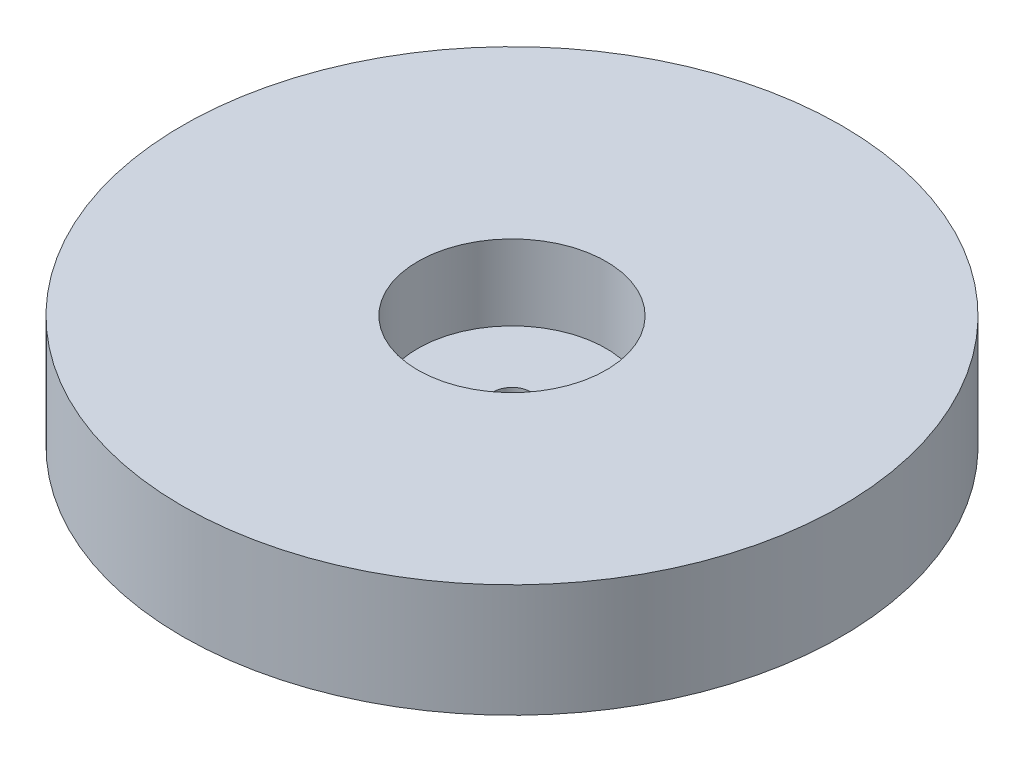
ISO-10303-21;
HEADER;
FILE_DESCRIPTION(('STEP AP214'),'2;1');
FILE_NAME('part.step','',(''),(''),'','','');
FILE_SCHEMA(('AUTOMOTIVE_DESIGN { 1 0 10303 214 1 1 1 1 }'));
ENDSEC;
DATA;
#1=APPLICATION_CONTEXT('core data for automotive mechanical design processes');
#2=APPLICATION_PROTOCOL_DEFINITION('international standard','automotive_design',2000,#1);
#3=PRODUCT_CONTEXT('',#1,'mechanical');
#4=PRODUCT('Part','Part','',(#3));
#5=PRODUCT_RELATED_PRODUCT_CATEGORY('part','',(#4));
#6=PRODUCT_DEFINITION_FORMATION('','',#4);
#7=PRODUCT_DEFINITION_CONTEXT('part definition',#1,'design');
#8=PRODUCT_DEFINITION('design','',#6,#7);
#9=PRODUCT_DEFINITION_SHAPE('','',#8);
#10=(LENGTH_UNIT() NAMED_UNIT(*) SI_UNIT(.MILLI.,.METRE.));
#11=(NAMED_UNIT(*) PLANE_ANGLE_UNIT() SI_UNIT($,.RADIAN.));
#12=(NAMED_UNIT(*) SI_UNIT($,.STERADIAN.) SOLID_ANGLE_UNIT());
#13=UNCERTAINTY_MEASURE_WITH_UNIT(LENGTH_MEASURE(1.E-05),#10,'distance_accuracy_value','');
#14=(GEOMETRIC_REPRESENTATION_CONTEXT(3) GLOBAL_UNCERTAINTY_ASSIGNED_CONTEXT((#13)) GLOBAL_UNIT_ASSIGNED_CONTEXT((#10,
#11,#12)) REPRESENTATION_CONTEXT('',''));
#15=CARTESIAN_POINT('',(0.,0.,0.));
#16=DIRECTION('',(0.,0.,1.));
#17=DIRECTION('',(1.,0.,0.));
#18=AXIS2_PLACEMENT_3D('',#15,#16,#17);
#19=CARTESIAN_POINT('',(0.,12.,0.));
#20=DIRECTION('',(0.,-1.,0.));
#21=DIRECTION('',(0.,0.,-1.));
#22=AXIS2_PLACEMENT_3D('',#19,#20,#21);
#23=CYLINDRICAL_SURFACE('',#22,35.);
#24=CARTESIAN_POINT('',(0.,12.,0.));
#25=DIRECTION('',(0.,1.,0.));
#26=DIRECTION('',(0.,0.,1.));
#27=AXIS2_PLACEMENT_3D('',#24,#25,#26);
#28=CIRCLE('',#27,35.);
#29=CARTESIAN_POINT('',(0.,12.,35.));
#30=VERTEX_POINT('',#29);
#31=EDGE_CURVE('E10',#30,#30,#28,.T.);
#32=ORIENTED_EDGE('',*,*,#31,.F.);
#33=EDGE_LOOP('',(#32));
#34=FACE_BOUND('',#33,.T.);
#35=CARTESIAN_POINT('',(0.,0.,0.));
#36=DIRECTION('',(0.,1.,0.));
#37=DIRECTION('',(0.,0.,1.));
#38=AXIS2_PLACEMENT_3D('',#35,#36,#37);
#39=CIRCLE('',#38,35.);
#40=CARTESIAN_POINT('',(0.,0.,35.));
#41=VERTEX_POINT('',#40);
#42=EDGE_CURVE('E38',#41,#41,#39,.T.);
#43=ORIENTED_EDGE('',*,*,#42,.T.);
#44=EDGE_LOOP('',(#43));
#45=FACE_BOUND('',#44,.T.);
#46=ADVANCED_FACE('F31',(#34,#45),#23,.T.);
#47=CARTESIAN_POINT('',(0.,12.,0.));
#48=DIRECTION('',(0.,1.,0.));
#49=DIRECTION('',(0.,0.,1.));
#50=AXIS2_PLACEMENT_3D('',#47,#48,#49);
#51=PLANE('',#50);
#52=CARTESIAN_POINT('',(0.,12.,0.));
#53=DIRECTION('',(0.,1.,0.));
#54=DIRECTION('',(0.,0.,1.));
#55=AXIS2_PLACEMENT_3D('',#52,#53,#54);
#56=CIRCLE('',#55,10.);
#57=CARTESIAN_POINT('',(0.,12.,10.));
#58=VERTEX_POINT('',#57);
#59=EDGE_CURVE('E45',#58,#58,#56,.T.);
#60=ORIENTED_EDGE('',*,*,#59,.F.);
#61=EDGE_LOOP('',(#60));
#62=FACE_BOUND('',#61,.T.);
#63=ORIENTED_EDGE('',*,*,#31,.T.);
#64=EDGE_LOOP('',(#63));
#65=FACE_BOUND('',#64,.T.);
#66=ADVANCED_FACE('F71',(#62,#65),#51,.T.);
#67=CARTESIAN_POINT('',(0.,0.,0.));
#68=DIRECTION('',(0.,1.,0.));
#69=DIRECTION('',(0.,0.,1.));
#70=AXIS2_PLACEMENT_3D('',#67,#68,#69);
#71=PLANE('',#70);
#72=CARTESIAN_POINT('',(0.,0.,0.));
#73=DIRECTION('',(0.,1.,0.));
#74=DIRECTION('',(0.,0.,1.));
#75=AXIS2_PLACEMENT_3D('',#72,#73,#74);
#76=CIRCLE('',#75,2.);
#77=CARTESIAN_POINT('',(0.,0.,2.));
#78=VERTEX_POINT('',#77);
#79=EDGE_CURVE('E34',#78,#78,#76,.T.);
#80=ORIENTED_EDGE('',*,*,#79,.T.);
#81=EDGE_LOOP('',(#80));
#82=FACE_BOUND('',#81,.T.);
#83=ORIENTED_EDGE('',*,*,#42,.F.);
#84=EDGE_LOOP('',(#83));
#85=FACE_BOUND('',#84,.T.);
#86=ADVANCED_FACE('F57',(#82,#85),#71,.F.);
#87=CARTESIAN_POINT('',(0.,4.,0.));
#88=DIRECTION('',(0.,1.,0.));
#89=DIRECTION('',(0.,0.,1.));
#90=AXIS2_PLACEMENT_3D('',#87,#88,#89);
#91=CYLINDRICAL_SURFACE('',#90,10.);
#92=CARTESIAN_POINT('',(0.,4.,0.));
#93=DIRECTION('',(0.,1.,0.));
#94=DIRECTION('',(0.,0.,1.));
#95=AXIS2_PLACEMENT_3D('',#92,#93,#94);
#96=CIRCLE('',#95,10.);
#97=CARTESIAN_POINT('',(0.,4.,10.));
#98=VERTEX_POINT('',#97);
#99=EDGE_CURVE('E43',#98,#98,#96,.T.);
#100=ORIENTED_EDGE('',*,*,#99,.F.);
#101=EDGE_LOOP('',(#100));
#102=FACE_BOUND('',#101,.T.);
#103=ORIENTED_EDGE('',*,*,#59,.T.);
#104=EDGE_LOOP('',(#103));
#105=FACE_BOUND('',#104,.T.);
#106=ADVANCED_FACE('F67',(#102,#105),#91,.F.);
#107=CARTESIAN_POINT('',(0.,4.,0.));
#108=DIRECTION('',(0.,1.,0.));
#109=DIRECTION('',(0.,0.,1.));
#110=AXIS2_PLACEMENT_3D('',#107,#108,#109);
#111=PLANE('',#110);
#112=CARTESIAN_POINT('',(0.,4.,0.));
#113=DIRECTION('',(0.,1.,0.));
#114=DIRECTION('',(0.,0.,1.));
#115=AXIS2_PLACEMENT_3D('',#112,#113,#114);
#116=CIRCLE('',#115,2.);
#117=CARTESIAN_POINT('',(0.,4.,2.));
#118=VERTEX_POINT('',#117);
#119=EDGE_CURVE('E50',#118,#118,#116,.T.);
#120=ORIENTED_EDGE('',*,*,#119,.F.);
#121=EDGE_LOOP('',(#120));
#122=FACE_BOUND('',#121,.T.);
#123=ORIENTED_EDGE('',*,*,#99,.T.);
#124=EDGE_LOOP('',(#123));
#125=FACE_BOUND('',#124,.T.);
#126=ADVANCED_FACE('F62',(#122,#125),#111,.T.);
#127=CARTESIAN_POINT('',(0.,-4.,0.));
#128=DIRECTION('',(0.,1.,0.));
#129=DIRECTION('',(0.,0.,1.));
#130=AXIS2_PLACEMENT_3D('',#127,#128,#129);
#131=CYLINDRICAL_SURFACE('',#130,2.);
#132=ORIENTED_EDGE('',*,*,#119,.T.);
#133=EDGE_LOOP('',(#132));
#134=FACE_BOUND('',#133,.T.);
#135=ORIENTED_EDGE('',*,*,#79,.F.);
#136=EDGE_LOOP('',(#135));
#137=FACE_BOUND('',#136,.T.);
#138=ADVANCED_FACE('F60',(#134,#137),#131,.F.);
#139=CLOSED_SHELL('',(#46,#66,#86,#106,#126,#138));
#140=MANIFOLD_SOLID_BREP('B2',#139);
#141=ADVANCED_BREP_SHAPE_REPRESENTATION('',(#18,#140),#14);
#142=SHAPE_DEFINITION_REPRESENTATION(#9,#141);
ENDSEC;
END-ISO-10303-21;
